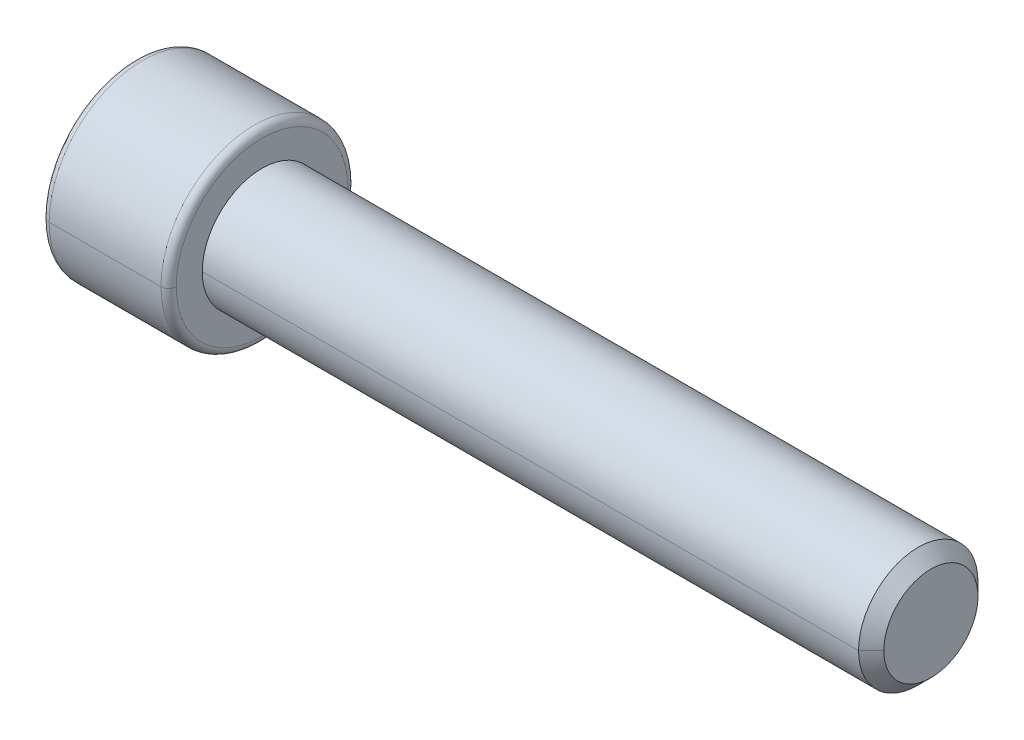
ISO-10303-21;
HEADER;
FILE_DESCRIPTION(('STEP AP214'),'2;1');
FILE_NAME('part.step','',(''),(''),'','','');
FILE_SCHEMA(('AUTOMOTIVE_DESIGN { 1 0 10303 214 1 1 1 1 }'));
ENDSEC;
DATA;
#1=APPLICATION_CONTEXT('core data for automotive mechanical design processes');
#2=APPLICATION_PROTOCOL_DEFINITION('international standard','automotive_design',2000,#1);
#3=PRODUCT_CONTEXT('',#1,'mechanical');
#4=PRODUCT('Part','Part','',(#3));
#5=PRODUCT_RELATED_PRODUCT_CATEGORY('part','',(#4));
#6=PRODUCT_DEFINITION_FORMATION('','',#4);
#7=PRODUCT_DEFINITION_CONTEXT('part definition',#1,'design');
#8=PRODUCT_DEFINITION('design','',#6,#7);
#9=PRODUCT_DEFINITION_SHAPE('','',#8);
#10=(LENGTH_UNIT() NAMED_UNIT(*) SI_UNIT(.MILLI.,.METRE.));
#11=(NAMED_UNIT(*) PLANE_ANGLE_UNIT() SI_UNIT($,.RADIAN.));
#12=(NAMED_UNIT(*) SI_UNIT($,.STERADIAN.) SOLID_ANGLE_UNIT());
#13=UNCERTAINTY_MEASURE_WITH_UNIT(LENGTH_MEASURE(1.E-05),#10,'distance_accuracy_value','');
#14=(GEOMETRIC_REPRESENTATION_CONTEXT(3) GLOBAL_UNCERTAINTY_ASSIGNED_CONTEXT((#13)) GLOBAL_UNIT_ASSIGNED_CONTEXT((#10,
#11,#12)) REPRESENTATION_CONTEXT('',''));
#15=CARTESIAN_POINT('',(0.,0.,0.));
#16=DIRECTION('',(0.,0.,1.));
#17=DIRECTION('',(1.,0.,0.));
#18=AXIS2_PLACEMENT_3D('',#15,#16,#17);
#19=CARTESIAN_POINT('',(-7.9375000000001,0.,0.));
#20=DIRECTION('',(1.,0.,0.));
#21=DIRECTION('',(0.,1.,0.));
#22=AXIS2_PLACEMENT_3D('',#19,#20,#21);
#23=TOROIDAL_SURFACE('',#22,5.699125,0.508);
#24=CARTESIAN_POINT('',(-8.4455,0.,0.));
#25=DIRECTION('',(1.,0.,0.));
#26=DIRECTION('',(0.,0.,-1.));
#27=AXIS2_PLACEMENT_3D('',#24,#25,#26);
#28=CIRCLE('',#27,5.699125);
#29=CARTESIAN_POINT('',(-8.4455000000001,0.,5.699125));
#30=VERTEX_POINT('',#29);
#31=CARTESIAN_POINT('',(-8.4455,0.,-5.699125));
#32=VERTEX_POINT('',#31);
#33=EDGE_CURVE('E11',#30,#32,#28,.T.);
#34=ORIENTED_EDGE('',*,*,#33,.T.);
#35=CARTESIAN_POINT('',(-8.4455000000001,0.,-5.699125));
#36=CARTESIAN_POINT('',(-8.4455001763212,0.,-5.70743713895653));
#37=CARTESIAN_POINT('',(-8.44529599589968,0.,-5.71574926290987));
#38=CARTESIAN_POINT('',(-8.44448018760498,0.,-5.73235349420679));
#39=CARTESIAN_POINT('',(-8.4438685597318,0.,-5.74064560155038));
#40=CARTESIAN_POINT('',(-8.44223912256735,0.,-5.75718981302445));
#41=CARTESIAN_POINT('',(-8.44122131327609,0.,-5.76544191715494));
#42=CARTESIAN_POINT('',(-8.43878202084833,0.,-5.7818862448917));
#43=CARTESIAN_POINT('',(-8.43736053771183,0.,-5.79007846849797));
#44=CARTESIAN_POINT('',(-8.43411730717806,0.,-5.80638329867041));
#45=CARTESIAN_POINT('',(-8.43229555978079,0.,-5.81449590523659));
#46=CARTESIAN_POINT('',(-8.42825619346507,0.,-5.83062195754512));
#47=CARTESIAN_POINT('',(-8.42603857454662,0.,-5.83863540328746));
#48=CARTESIAN_POINT('',(-8.4212128065575,0.,-5.85454382880307));
#49=CARTESIAN_POINT('',(-8.41860465748683,0.,-5.86243880857635));
#50=CARTESIAN_POINT('',(-8.41300411273932,0.,-5.87809128247014));
#51=CARTESIAN_POINT('',(-8.41001171706249,0.,-5.88584877659064));
#52=CARTESIAN_POINT('',(-8.40364988796918,0.,-5.90120759069229));
#53=CARTESIAN_POINT('',(-8.40028045455271,0.,-5.90880891067343));
#54=CARTESIAN_POINT('',(-8.39317266726091,0.,-5.92383706425173));
#55=CARTESIAN_POINT('',(-8.3894343133856,0.,-5.93126389784889));
#56=CARTESIAN_POINT('',(-8.38159769119254,0.,-5.94592518676631));
#57=CARTESIAN_POINT('',(-8.37749942287479,0.,-5.95315964208657));
#58=CARTESIAN_POINT('',(-8.36895284488569,0.,-5.96741874601373));
#59=CARTESIAN_POINT('',(-8.36450453521434,0.,-5.97444339462063));
#60=CARTESIAN_POINT('',(-8.35526859088525,0.,-5.98826596212728));
#61=CARTESIAN_POINT('',(-8.35048095622752,0.,-5.99506388102702));
#62=CARTESIAN_POINT('',(-8.34057789575702,0.,-6.00841661233729));
#63=CARTESIAN_POINT('',(-8.33546246994425,0.,-6.01497142474782));
#64=CARTESIAN_POINT('',(-8.32491615067249,0.,-6.02782215196244));
#65=CARTESIAN_POINT('',(-8.3194852572135,0.,-6.03411806676653));
#66=CARTESIAN_POINT('',(-8.30832108614734,0.,-6.04643583135804));
#67=CARTESIAN_POINT('',(-8.30258780854017,0.,-6.05245768114547));
#68=CARTESIAN_POINT('',(-8.29083268114557,0.,-6.06421280854006));
#69=CARTESIAN_POINT('',(-8.28481083135814,0.,-6.06994608614723));
#70=CARTESIAN_POINT('',(-8.27249306676663,0.,-6.0811102572134));
#71=CARTESIAN_POINT('',(-8.26619715196254,0.,-6.08654115067239));
#72=CARTESIAN_POINT('',(-8.25334642474793,0.,-6.09708746994415));
#73=CARTESIAN_POINT('',(-8.24679161233739,0.,-6.10220289575691));
#74=CARTESIAN_POINT('',(-8.23343888102712,0.,-6.11210595622742));
#75=CARTESIAN_POINT('',(-8.22664096212738,0.,-6.11689359088515));
#76=CARTESIAN_POINT('',(-8.21281839462074,0.,-6.12612953521423));
#77=CARTESIAN_POINT('',(-8.20579374601384,0.,-6.13057784488559));
#78=CARTESIAN_POINT('',(-8.19153464208668,0.,-6.13912442287469));
#79=CARTESIAN_POINT('',(-8.18430018676642,0.,-6.14322269119243));
#80=CARTESIAN_POINT('',(-8.169638897849,0.,-6.15105931338549));
#81=CARTESIAN_POINT('',(-8.16221206425184,0.,-6.15479766726081));
#82=CARTESIAN_POINT('',(-8.14718391067353,0.,-6.1619054545526));
#83=CARTESIAN_POINT('',(-8.13958259069239,0.,-6.16527488796908));
#84=CARTESIAN_POINT('',(-8.12422377659074,0.,-6.17163671706239));
#85=CARTESIAN_POINT('',(-8.11646628247024,0.,-6.17462911273922));
#86=CARTESIAN_POINT('',(-8.10081380857646,0.,-6.18022965748673));
#87=CARTESIAN_POINT('',(-8.09291882880318,0.,-6.1828378065574));
#88=CARTESIAN_POINT('',(-8.07701040328756,0.,-6.18766357454652));
#89=CARTESIAN_POINT('',(-8.06899695754522,0.,-6.18988119346497));
#90=CARTESIAN_POINT('',(-8.0528709052367,0.,-6.19392055978069));
#91=CARTESIAN_POINT('',(-8.04475829867052,0.,-6.19574230717796));
#92=CARTESIAN_POINT('',(-8.02845346849807,0.,-6.19898553771173));
#93=CARTESIAN_POINT('',(-8.02026124489181,0.,-6.20040702084823));
#94=CARTESIAN_POINT('',(-8.00381691715505,0.,-6.20284631327599));
#95=CARTESIAN_POINT('',(-7.99556481302456,0.,-6.20386412256725));
#96=CARTESIAN_POINT('',(-7.97902060155048,0.,-6.2054935597317));
#97=CARTESIAN_POINT('',(-7.97072849420689,0.,-6.20610518760488));
#98=CARTESIAN_POINT('',(-7.95412426290997,0.,-6.20692099589958));
#99=CARTESIAN_POINT('',(-7.94581213895663,0.,-6.2071251763211));
#100=CARTESIAN_POINT('',(-7.9375000000001,0.,-6.207125));
#101=B_SPLINE_CURVE_WITH_KNOTS('',3,(#35,#36,#37,#38,#39,#40,#41,#42,#43,#44,#45,#46,#47,#48,
#49,#50,#51,#52,#53,#54,#55,#56,#57,#58,#59,#60,#61,#62,#63,#64,#65,#66,#67,#68,#69,#70,#71,#72,
#73,#74,#75,#76,#77,#78,#79,#80,#81,#82,#83,#84,#85,#86,#87,#88,#89,#90,#91,#92,#93,#94,#95,#96,
#97,#98,#99,#100),.UNSPECIFIED.,.F.,.F.,(4,2,2,2,2,2,2,2,2,2,2,2,2,2,2,2,2,2,2,2,2,2,2,2,2,2,2,
2,2,2,2,2,4),(0.,0.0249338881792791,0.049867776358558,0.0748016645378365,0.0997355527171156,
0.124669440896394,0.149603329075673,0.174537217254952,0.199471105434231,0.22440499361351,
0.249338881792789,0.274272769972068,0.299206658151346,0.324140546330625,0.349074434509904,
0.374008322689184,0.398942210868461,0.423876099047741,0.44880998722702,0.473743875406298,
0.498677763585578,0.523611651764855,0.548545539944134,0.573479428123415,0.598413316302693,
0.623347204481971,0.648281092661251,0.67321498084053,0.698148869019808,0.723082757199088,
0.748016645378365,0.772950533557645,0.797884421736924),.UNSPECIFIED.);
#102=CARTESIAN_POINT('',(-7.9375,0.,-6.207125));
#103=VERTEX_POINT('',#102);
#104=EDGE_CURVE('E25',#32,#103,#101,.T.);
#105=ORIENTED_EDGE('',*,*,#104,.T.);
#106=CARTESIAN_POINT('',(-7.9375,0.,0.));
#107=DIRECTION('',(1.,0.,0.));
#108=DIRECTION('',(0.,0.,-1.));
#109=AXIS2_PLACEMENT_3D('',#106,#107,#108);
#110=CIRCLE('',#109,6.207125);
#111=CARTESIAN_POINT('',(-7.9375000000001,0.,6.207125));
#112=VERTEX_POINT('',#111);
#113=EDGE_CURVE('E374',#112,#103,#110,.T.);
#114=ORIENTED_EDGE('',*,*,#113,.F.);
#115=CARTESIAN_POINT('',(-8.4455000000001,0.,5.699125));
#116=CARTESIAN_POINT('',(-8.4455001763212,0.,5.70743713895653));
#117=CARTESIAN_POINT('',(-8.44529599589968,0.,5.71574926290987));
#118=CARTESIAN_POINT('',(-8.44448018760498,0.,5.73235349420679));
#119=CARTESIAN_POINT('',(-8.4438685597318,0.,5.74064560155038));
#120=CARTESIAN_POINT('',(-8.44223912256735,0.,5.75718981302445));
#121=CARTESIAN_POINT('',(-8.44122131327609,0.,5.76544191715494));
#122=CARTESIAN_POINT('',(-8.43878202084833,0.,5.7818862448917));
#123=CARTESIAN_POINT('',(-8.43736053771183,0.,5.79007846849797));
#124=CARTESIAN_POINT('',(-8.43411730717806,0.,5.80638329867041));
#125=CARTESIAN_POINT('',(-8.43229555978079,0.,5.8144959052366));
#126=CARTESIAN_POINT('',(-8.42825619346507,0.,5.83062195754512));
#127=CARTESIAN_POINT('',(-8.42603857454662,0.,5.83863540328746));
#128=CARTESIAN_POINT('',(-8.4212128065575,0.,5.85454382880307));
#129=CARTESIAN_POINT('',(-8.41860465748683,0.,5.86243880857635));
#130=CARTESIAN_POINT('',(-8.41300411273932,0.,5.87809128247014));
#131=CARTESIAN_POINT('',(-8.41001171706249,0.,5.88584877659064));
#132=CARTESIAN_POINT('',(-8.40364988796918,0.,5.90120759069229));
#133=CARTESIAN_POINT('',(-8.40028045455271,0.,5.90880891067343));
#134=CARTESIAN_POINT('',(-8.39317266726091,0.,5.92383706425173));
#135=CARTESIAN_POINT('',(-8.3894343133856,0.,5.9312638978489));
#136=CARTESIAN_POINT('',(-8.38159769119254,0.,5.94592518676632));
#137=CARTESIAN_POINT('',(-8.37749942287479,0.,5.95315964208658));
#138=CARTESIAN_POINT('',(-8.36895284488569,0.,5.96741874601373));
#139=CARTESIAN_POINT('',(-8.36450453521434,0.,5.97444339462063));
#140=CARTESIAN_POINT('',(-8.35526859088525,0.,5.98826596212728));
#141=CARTESIAN_POINT('',(-8.35048095622752,0.,5.99506388102702));
#142=CARTESIAN_POINT('',(-8.34057789575702,0.,6.00841661233729));
#143=CARTESIAN_POINT('',(-8.33546246994425,0.,6.01497142474782));
#144=CARTESIAN_POINT('',(-8.32491615067249,0.,6.02782215196244));
#145=CARTESIAN_POINT('',(-8.3194852572135,0.,6.03411806676653));
#146=CARTESIAN_POINT('',(-8.30832108614734,0.,6.04643583135804));
#147=CARTESIAN_POINT('',(-8.30258780854017,0.,6.05245768114547));
#148=CARTESIAN_POINT('',(-8.29083268114557,0.,6.06421280854006));
#149=CARTESIAN_POINT('',(-8.28481083135814,0.,6.06994608614724));
#150=CARTESIAN_POINT('',(-8.27249306676663,0.,6.0811102572134));
#151=CARTESIAN_POINT('',(-8.26619715196254,0.,6.08654115067239));
#152=CARTESIAN_POINT('',(-8.25334642474793,0.,6.09708746994415));
#153=CARTESIAN_POINT('',(-8.24679161233739,0.,6.10220289575692));
#154=CARTESIAN_POINT('',(-8.23343888102712,0.,6.11210595622742));
#155=CARTESIAN_POINT('',(-8.22664096212738,0.,6.11689359088515));
#156=CARTESIAN_POINT('',(-8.21281839462074,0.,6.12612953521423));
#157=CARTESIAN_POINT('',(-8.20579374601384,0.,6.13057784488559));
#158=CARTESIAN_POINT('',(-8.19153464208668,0.,6.13912442287469));
#159=CARTESIAN_POINT('',(-8.18430018676642,0.,6.14322269119243));
#160=CARTESIAN_POINT('',(-8.169638897849,0.,6.15105931338549));
#161=CARTESIAN_POINT('',(-8.16221206425184,0.,6.15479766726081));
#162=CARTESIAN_POINT('',(-8.14718391067353,0.,6.1619054545526));
#163=CARTESIAN_POINT('',(-8.13958259069239,0.,6.16527488796908));
#164=CARTESIAN_POINT('',(-8.12422377659074,0.,6.17163671706239));
#165=CARTESIAN_POINT('',(-8.11646628247024,0.,6.17462911273922));
#166=CARTESIAN_POINT('',(-8.10081380857646,0.,6.18022965748673));
#167=CARTESIAN_POINT('',(-8.09291882880318,0.,6.1828378065574));
#168=CARTESIAN_POINT('',(-8.07701040328756,0.,6.18766357454652));
#169=CARTESIAN_POINT('',(-8.06899695754522,0.,6.18988119346497));
#170=CARTESIAN_POINT('',(-8.0528709052367,0.,6.19392055978069));
#171=CARTESIAN_POINT('',(-8.04475829867052,0.,6.19574230717796));
#172=CARTESIAN_POINT('',(-8.02845346849807,0.,6.19898553771173));
#173=CARTESIAN_POINT('',(-8.02026124489181,0.,6.20040702084823));
#174=CARTESIAN_POINT('',(-8.00381691715505,0.,6.20284631327599));
#175=CARTESIAN_POINT('',(-7.99556481302456,0.,6.20386412256725));
#176=CARTESIAN_POINT('',(-7.97902060155048,0.,6.2054935597317));
#177=CARTESIAN_POINT('',(-7.97072849420689,0.,6.20610518760488));
#178=CARTESIAN_POINT('',(-7.95412426290997,0.,6.20692099589958));
#179=CARTESIAN_POINT('',(-7.94581213895663,0.,6.2071251763211));
#180=CARTESIAN_POINT('',(-7.9375000000001,0.,6.207125));
#181=B_SPLINE_CURVE_WITH_KNOTS('',3,(#115,#116,#117,#118,#119,#120,#121,#122,#123,#124,#125,
#126,#127,#128,#129,#130,#131,#132,#133,#134,#135,#136,#137,#138,#139,#140,#141,#142,#143,#144,
#145,#146,#147,#148,#149,#150,#151,#152,#153,#154,#155,#156,#157,#158,#159,#160,#161,#162,#163,
#164,#165,#166,#167,#168,#169,#170,#171,#172,#173,#174,#175,#176,#177,#178,#179,#180),
.UNSPECIFIED.,.F.,.F.,(4,2,2,2,2,2,2,2,2,2,2,2,2,2,2,2,2,2,2,2,2,2,2,2,2,2,2,2,2,2,2,2,4),(0.,
0.0249338881792782,0.0498677763585571,0.0748016645378365,0.0997355527171148,0.124669440896394,
0.149603329075673,0.174537217254952,0.19947110543423,0.224404993613509,0.249338881792789,
0.274272769972068,0.299206658151346,0.324140546330624,0.349074434509904,0.374008322689183,
0.398942210868461,0.42387609904774,0.448809987227019,0.473743875406298,0.498677763585577,
0.523611651764856,0.548545539944135,0.573479428123414,0.598413316302692,0.623347204481971,
0.64828109266125,0.673214980840529,0.698148869019807,0.723082757199087,0.748016645378365,
0.772950533557644,0.797884421736924),.UNSPECIFIED.);
#182=EDGE_CURVE('E362',#30,#112,#181,.T.);
#183=ORIENTED_EDGE('',*,*,#182,.F.);
#184=EDGE_LOOP('',(#34,#105,#114,#183));
#185=FACE_BOUND('',#184,.T.);
#186=ADVANCED_FACE('F16',(#185),#23,.T.);
#187=CARTESIAN_POINT('',(-7.9375000000001,0.,0.));
#188=DIRECTION('',(1.,0.,0.));
#189=DIRECTION('',(0.,-1.,0.));
#190=AXIS2_PLACEMENT_3D('',#187,#188,#189);
#191=TOROIDAL_SURFACE('',#190,5.699125,0.508);
#192=CARTESIAN_POINT('',(-7.9375,0.,0.));
#193=DIRECTION('',(1.,0.,0.));
#194=DIRECTION('',(0.,0.,-1.));
#195=AXIS2_PLACEMENT_3D('',#192,#193,#194);
#196=CIRCLE('',#195,6.207125);
#197=EDGE_CURVE('E359',#103,#112,#196,.T.);
#198=ORIENTED_EDGE('',*,*,#197,.F.);
#199=ORIENTED_EDGE('',*,*,#104,.F.);
#200=CARTESIAN_POINT('',(-8.4455,0.,0.));
#201=DIRECTION('',(1.,0.,0.));
#202=DIRECTION('',(0.,0.,-1.));
#203=AXIS2_PLACEMENT_3D('',#200,#201,#202);
#204=CIRCLE('',#203,5.699125);
#205=EDGE_CURVE('E324',#32,#30,#204,.T.);
#206=ORIENTED_EDGE('',*,*,#205,.T.);
#207=ORIENTED_EDGE('',*,*,#182,.T.);
#208=EDGE_LOOP('',(#198,#199,#206,#207));
#209=FACE_BOUND('',#208,.T.);
#210=ADVANCED_FACE('F332',(#209),#191,.T.);
#211=CARTESIAN_POINT('',(-8.4455,0.,0.));
#212=DIRECTION('',(1.,0.,0.));
#213=DIRECTION('',(0.,0.,-1.));
#214=AXIS2_PLACEMENT_3D('',#211,#212,#213);
#215=PLANE('',#214);
#216=ORIENTED_EDGE('',*,*,#205,.F.);
#217=ORIENTED_EDGE('',*,*,#33,.F.);
#218=EDGE_LOOP('',(#216,#217));
#219=FACE_BOUND('',#218,.T.);
#220=DIRECTION('',(0.,-1.,0.));
#221=VECTOR('',#220,1.);
#222=CARTESIAN_POINT('',(-8.4455,1.8330871046771,3.175));
#223=LINE('',#222,#221);
#224=CARTESIAN_POINT('',(-8.4455,1.8330871046771,3.175));
#225=VERTEX_POINT('',#224);
#226=CARTESIAN_POINT('',(-8.4455,-1.8330871046771,3.175));
#227=VERTEX_POINT('',#226);
#228=EDGE_CURVE('E320',#225,#227,#223,.T.);
#229=ORIENTED_EDGE('',*,*,#228,.T.);
#230=DIRECTION('',(0.,-0.499999999999987,-0.866025403784446));
#231=VECTOR('',#230,1.);
#232=CARTESIAN_POINT('',(-8.4455,-1.8330871046771,3.175));
#233=LINE('',#232,#231);
#234=CARTESIAN_POINT('',(-8.4455,-3.66617420935411,0.));
#235=VERTEX_POINT('',#234);
#236=EDGE_CURVE('E316',#227,#235,#233,.T.);
#237=ORIENTED_EDGE('',*,*,#236,.T.);
#238=DIRECTION('',(0.,0.499999999999987,-0.866025403784446));
#239=VECTOR('',#238,1.);
#240=CARTESIAN_POINT('',(-8.4455,-3.66617420935411,0.));
#241=LINE('',#240,#239);
#242=CARTESIAN_POINT('',(-8.4455,-1.8330871046771,-3.175));
#243=VERTEX_POINT('',#242);
#244=EDGE_CURVE('E312',#235,#243,#241,.T.);
#245=ORIENTED_EDGE('',*,*,#244,.T.);
#246=DIRECTION('',(0.,1.,0.));
#247=VECTOR('',#246,1.);
#248=CARTESIAN_POINT('',(-8.4455,-1.8330871046771,-3.175));
#249=LINE('',#248,#247);
#250=CARTESIAN_POINT('',(-8.4455,1.8330871046771,-3.175));
#251=VERTEX_POINT('',#250);
#252=EDGE_CURVE('E308',#243,#251,#249,.T.);
#253=ORIENTED_EDGE('',*,*,#252,.T.);
#254=DIRECTION('',(0.,0.499999999999987,0.866025403784446));
#255=VECTOR('',#254,1.);
#256=CARTESIAN_POINT('',(-8.4455,1.8330871046771,-3.175));
#257=LINE('',#256,#255);
#258=CARTESIAN_POINT('',(-8.4455,3.66617420935411,0.));
#259=VERTEX_POINT('',#258);
#260=EDGE_CURVE('E304',#251,#259,#257,.T.);
#261=ORIENTED_EDGE('',*,*,#260,.T.);
#262=DIRECTION('',(0.,-0.499999999999987,0.866025403784446));
#263=VECTOR('',#262,1.);
#264=CARTESIAN_POINT('',(-8.4455,3.66617420935411,0.));
#265=LINE('',#264,#263);
#266=EDGE_CURVE('E300',#259,#225,#265,.T.);
#267=ORIENTED_EDGE('',*,*,#266,.T.);
#268=EDGE_LOOP('',(#229,#237,#245,#253,#261,#267));
#269=FACE_BOUND('',#268,.T.);
#270=ADVANCED_FACE('F341',(#219,#269),#215,.F.);
#271=CARTESIAN_POINT('',(-5.2705,3.66617420935411,0.));
#272=DIRECTION('',(0.,-0.866025403784446,-0.499999999999987));
#273=DIRECTION('',(0.,0.499999999999987,-0.866025403784446));
#274=AXIS2_PLACEMENT_3D('',#271,#272,#273);
#275=PLANE('',#274);
#276=ORIENTED_EDGE('',*,*,#266,.F.);
#277=DIRECTION('',(-1.,0.,0.));
#278=VECTOR('',#277,1.);
#279=CARTESIAN_POINT('',(-5.2705,3.66617420935411,0.));
#280=LINE('',#279,#278);
#281=CARTESIAN_POINT('',(-5.2705,3.66617420935411,0.));
#282=VERTEX_POINT('',#281);
#283=EDGE_CURVE('E295',#282,#259,#280,.T.);
#284=ORIENTED_EDGE('',*,*,#283,.F.);
#285=DIRECTION('',(0.,-0.499999999999987,0.866025403784446));
#286=VECTOR('',#285,1.);
#287=CARTESIAN_POINT('',(-5.2705,3.66617420935411,0.));
#288=LINE('',#287,#286);
#289=CARTESIAN_POINT('',(-5.2705,1.8330871046771,3.175));
#290=VERTEX_POINT('',#289);
#291=EDGE_CURVE('E291',#282,#290,#288,.T.);
#292=ORIENTED_EDGE('',*,*,#291,.T.);
#293=DIRECTION('',(-1.,0.,0.));
#294=VECTOR('',#293,1.);
#295=CARTESIAN_POINT('',(-5.2705,1.8330871046771,3.175));
#296=LINE('',#295,#294);
#297=EDGE_CURVE('E286',#290,#225,#296,.T.);
#298=ORIENTED_EDGE('',*,*,#297,.T.);
#299=EDGE_LOOP('',(#276,#284,#292,#298));
#300=FACE_BOUND('',#299,.T.);
#301=ADVANCED_FACE('F412',(#300),#275,.T.);
#302=CARTESIAN_POINT('',(-5.2705,1.8330871046771,3.175));
#303=DIRECTION('',(0.,0.,-1.));
#304=DIRECTION('',(-1.,0.,0.));
#305=AXIS2_PLACEMENT_3D('',#302,#303,#304);
#306=PLANE('',#305);
#307=ORIENTED_EDGE('',*,*,#228,.F.);
#308=ORIENTED_EDGE('',*,*,#297,.F.);
#309=DIRECTION('',(0.,-1.,0.));
#310=VECTOR('',#309,1.);
#311=CARTESIAN_POINT('',(-5.2705,1.8330871046771,3.175));
#312=LINE('',#311,#310);
#313=CARTESIAN_POINT('',(-5.2705,-1.8330871046771,3.175));
#314=VERTEX_POINT('',#313);
#315=EDGE_CURVE('E282',#290,#314,#312,.T.);
#316=ORIENTED_EDGE('',*,*,#315,.T.);
#317=DIRECTION('',(-1.,0.,0.));
#318=VECTOR('',#317,1.);
#319=CARTESIAN_POINT('',(-5.2705,-1.8330871046771,3.175));
#320=LINE('',#319,#318);
#321=EDGE_CURVE('E277',#314,#227,#320,.T.);
#322=ORIENTED_EDGE('',*,*,#321,.T.);
#323=EDGE_LOOP('',(#307,#308,#316,#322));
#324=FACE_BOUND('',#323,.T.);
#325=ADVANCED_FACE('F419',(#324),#306,.T.);
#326=CARTESIAN_POINT('',(-5.2705,-1.8330871046771,3.175));
#327=DIRECTION('',(0.,0.866025403784446,-0.499999999999987));
#328=DIRECTION('',(0.,0.499999999999987,0.866025403784446));
#329=AXIS2_PLACEMENT_3D('',#326,#327,#328);
#330=PLANE('',#329);
#331=ORIENTED_EDGE('',*,*,#236,.F.);
#332=ORIENTED_EDGE('',*,*,#321,.F.);
#333=DIRECTION('',(0.,-0.499999999999987,-0.866025403784446));
#334=VECTOR('',#333,1.);
#335=CARTESIAN_POINT('',(-5.2705,-1.8330871046771,3.175));
#336=LINE('',#335,#334);
#337=CARTESIAN_POINT('',(-5.2705,-3.66617420935411,0.));
#338=VERTEX_POINT('',#337);
#339=EDGE_CURVE('E273',#314,#338,#336,.T.);
#340=ORIENTED_EDGE('',*,*,#339,.T.);
#341=DIRECTION('',(-1.,0.,0.));
#342=VECTOR('',#341,1.);
#343=CARTESIAN_POINT('',(-5.2705,-3.66617420935411,0.));
#344=LINE('',#343,#342);
#345=EDGE_CURVE('E268',#338,#235,#344,.T.);
#346=ORIENTED_EDGE('',*,*,#345,.T.);
#347=EDGE_LOOP('',(#331,#332,#340,#346));
#348=FACE_BOUND('',#347,.T.);
#349=ADVANCED_FACE('F426',(#348),#330,.T.);
#350=CARTESIAN_POINT('',(-5.2705,-3.66617420935411,0.));
#351=DIRECTION('',(0.,0.866025403784446,0.499999999999987));
#352=DIRECTION('',(0.,-0.499999999999987,0.866025403784446));
#353=AXIS2_PLACEMENT_3D('',#350,#351,#352);
#354=PLANE('',#353);
#355=ORIENTED_EDGE('',*,*,#244,.F.);
#356=ORIENTED_EDGE('',*,*,#345,.F.);
#357=DIRECTION('',(0.,0.499999999999987,-0.866025403784446));
#358=VECTOR('',#357,1.);
#359=CARTESIAN_POINT('',(-5.2705,-3.66617420935411,0.));
#360=LINE('',#359,#358);
#361=CARTESIAN_POINT('',(-5.2705,-1.8330871046771,-3.175));
#362=VERTEX_POINT('',#361);
#363=EDGE_CURVE('E264',#338,#362,#360,.T.);
#364=ORIENTED_EDGE('',*,*,#363,.T.);
#365=DIRECTION('',(-1.,0.,0.));
#366=VECTOR('',#365,1.);
#367=CARTESIAN_POINT('',(-5.2705,-1.8330871046771,-3.175));
#368=LINE('',#367,#366);
#369=EDGE_CURVE('E259',#362,#243,#368,.T.);
#370=ORIENTED_EDGE('',*,*,#369,.T.);
#371=EDGE_LOOP('',(#355,#356,#364,#370));
#372=FACE_BOUND('',#371,.T.);
#373=ADVANCED_FACE('F434',(#372),#354,.T.);
#374=CARTESIAN_POINT('',(-5.2705,-1.8330871046771,-3.175));
#375=DIRECTION('',(0.,0.,1.));
#376=DIRECTION('',(1.,0.,0.));
#377=AXIS2_PLACEMENT_3D('',#374,#375,#376);
#378=PLANE('',#377);
#379=ORIENTED_EDGE('',*,*,#252,.F.);
#380=ORIENTED_EDGE('',*,*,#369,.F.);
#381=DIRECTION('',(0.,1.,0.));
#382=VECTOR('',#381,1.);
#383=CARTESIAN_POINT('',(-5.2705,-1.8330871046771,-3.175));
#384=LINE('',#383,#382);
#385=CARTESIAN_POINT('',(-5.2705,1.8330871046771,-3.175));
#386=VERTEX_POINT('',#385);
#387=EDGE_CURVE('E255',#362,#386,#384,.T.);
#388=ORIENTED_EDGE('',*,*,#387,.T.);
#389=DIRECTION('',(-1.,0.,0.));
#390=VECTOR('',#389,1.);
#391=CARTESIAN_POINT('',(-5.2705,1.8330871046771,-3.175));
#392=LINE('',#391,#390);
#393=EDGE_CURVE('E250',#386,#251,#392,.T.);
#394=ORIENTED_EDGE('',*,*,#393,.T.);
#395=EDGE_LOOP('',(#379,#380,#388,#394));
#396=FACE_BOUND('',#395,.T.);
#397=ADVANCED_FACE('F442',(#396),#378,.T.);
#398=CARTESIAN_POINT('',(-5.2705,1.8330871046771,-3.175));
#399=DIRECTION('',(0.,-0.866025403784446,0.499999999999987));
#400=DIRECTION('',(0.,-0.499999999999987,-0.866025403784446));
#401=AXIS2_PLACEMENT_3D('',#398,#399,#400);
#402=PLANE('',#401);
#403=ORIENTED_EDGE('',*,*,#260,.F.);
#404=ORIENTED_EDGE('',*,*,#393,.F.);
#405=DIRECTION('',(0.,0.499999999999987,0.866025403784446));
#406=VECTOR('',#405,1.);
#407=CARTESIAN_POINT('',(-5.2705,1.8330871046771,-3.175));
#408=LINE('',#407,#406);
#409=EDGE_CURVE('E245',#386,#282,#408,.T.);
#410=ORIENTED_EDGE('',*,*,#409,.T.);
#411=ORIENTED_EDGE('',*,*,#283,.T.);
#412=EDGE_LOOP('',(#403,#404,#410,#411));
#413=FACE_BOUND('',#412,.T.);
#414=ADVANCED_FACE('F450',(#413),#402,.T.);
#415=CARTESIAN_POINT('',(-5.2705,0.,0.));
#416=DIRECTION('',(1.,0.,0.));
#417=DIRECTION('',(0.,0.,-1.));
#418=AXIS2_PLACEMENT_3D('',#415,#416,#417);
#419=PLANE('',#418);
#420=ORIENTED_EDGE('',*,*,#315,.F.);
#421=ORIENTED_EDGE('',*,*,#291,.F.);
#422=ORIENTED_EDGE('',*,*,#409,.F.);
#423=ORIENTED_EDGE('',*,*,#387,.F.);
#424=ORIENTED_EDGE('',*,*,#363,.F.);
#425=ORIENTED_EDGE('',*,*,#339,.F.);
#426=EDGE_LOOP('',(#420,#421,#422,#423,#424,#425));
#427=FACE_BOUND('',#426,.T.);
#428=ADVANCED_FACE('F458',(#427),#419,.F.);
#429=CARTESIAN_POINT('',(44.45,0.,0.));
#430=DIRECTION('',(-1.,0.,0.));
#431=DIRECTION('',(0.,-1.,0.));
#432=AXIS2_PLACEMENT_3D('',#429,#430,#431);
#433=CYLINDRICAL_SURFACE('',#432,6.207125);
#434=CARTESIAN_POINT('',(-0.508000000000003,0.,0.));
#435=DIRECTION('',(1.,0.,0.));
#436=DIRECTION('',(0.,0.,-1.));
#437=AXIS2_PLACEMENT_3D('',#434,#435,#436);
#438=CIRCLE('',#437,6.207125);
#439=CARTESIAN_POINT('',(-0.508000000000003,0.,-6.207125));
#440=VERTEX_POINT('',#439);
#441=CARTESIAN_POINT('',(-0.508000000000003,0.,6.207125));
#442=VERTEX_POINT('',#441);
#443=EDGE_CURVE('E241',#440,#442,#438,.T.);
#444=ORIENTED_EDGE('',*,*,#443,.F.);
#445=DIRECTION('',(-1.,0.,0.));
#446=VECTOR('',#445,1.);
#447=CARTESIAN_POINT('',(-0.508000000000003,0.,-6.207125));
#448=LINE('',#447,#446);
#449=EDGE_CURVE('E236',#440,#103,#448,.T.);
#450=ORIENTED_EDGE('',*,*,#449,.T.);
#451=ORIENTED_EDGE('',*,*,#197,.T.);
#452=DIRECTION('',(-1.,0.,0.));
#453=VECTOR('',#452,1.);
#454=CARTESIAN_POINT('',(-0.508000000000003,0.,6.207125));
#455=LINE('',#454,#453);
#456=EDGE_CURVE('E231',#442,#112,#455,.T.);
#457=ORIENTED_EDGE('',*,*,#456,.F.);
#458=EDGE_LOOP('',(#444,#450,#451,#457));
#459=FACE_BOUND('',#458,.T.);
#460=ADVANCED_FACE('F389',(#459),#433,.T.);
#461=CARTESIAN_POINT('',(44.45,0.,0.));
#462=DIRECTION('',(-1.,0.,0.));
#463=DIRECTION('',(0.,1.,0.));
#464=AXIS2_PLACEMENT_3D('',#461,#462,#463);
#465=CYLINDRICAL_SURFACE('',#464,6.207125);
#466=ORIENTED_EDGE('',*,*,#113,.T.);
#467=ORIENTED_EDGE('',*,*,#449,.F.);
#468=CARTESIAN_POINT('',(-0.508000000000003,0.,0.));
#469=DIRECTION('',(1.,0.,0.));
#470=DIRECTION('',(0.,0.,-1.));
#471=AXIS2_PLACEMENT_3D('',#468,#469,#470);
#472=CIRCLE('',#471,6.207125);
#473=EDGE_CURVE('E229',#442,#440,#472,.T.);
#474=ORIENTED_EDGE('',*,*,#473,.F.);
#475=ORIENTED_EDGE('',*,*,#456,.T.);
#476=EDGE_LOOP('',(#466,#467,#474,#475));
#477=FACE_BOUND('',#476,.T.);
#478=ADVANCED_FACE('F391',(#477),#465,.T.);
#479=CARTESIAN_POINT('',(-0.507999999999936,0.,0.));
#480=DIRECTION('',(1.,0.,0.));
#481=DIRECTION('',(0.,1.,0.));
#482=AXIS2_PLACEMENT_3D('',#479,#480,#481);
#483=TOROIDAL_SURFACE('',#482,5.699125,0.508);
#484=ORIENTED_EDGE('',*,*,#473,.T.);
#485=CARTESIAN_POINT('',(-0.507999999999936,0.,-6.207125));
#486=CARTESIAN_POINT('',(-0.499687861043404,0.,-6.2071251763211));
#487=CARTESIAN_POINT('',(-0.491375737090069,0.,-6.20692099589958));
#488=CARTESIAN_POINT('',(-0.474771505793147,0.,-6.20610518760488));
#489=CARTESIAN_POINT('',(-0.466479398449558,0.,-6.2054935597317));
#490=CARTESIAN_POINT('',(-0.449935186975481,0.,-6.20386412256725));
#491=CARTESIAN_POINT('',(-0.441683082844991,0.,-6.20284631327599));
#492=CARTESIAN_POINT('',(-0.425238755108234,0.,-6.20040702084823));
#493=CARTESIAN_POINT('',(-0.417046531501967,0.,-6.19898553771172));
#494=CARTESIAN_POINT('',(-0.400741701329519,0.,-6.19574230717796));
#495=CARTESIAN_POINT('',(-0.392629094763338,0.,-6.19392055978069));
#496=CARTESIAN_POINT('',(-0.376503042454818,0.,-6.18988119346497));
#497=CARTESIAN_POINT('',(-0.368489596712479,0.,-6.18766357454652));
#498=CARTESIAN_POINT('',(-0.35258117119686,0.,-6.1828378065574));
#499=CARTESIAN_POINT('',(-0.34468619142358,0.,-6.18022965748673));
#500=CARTESIAN_POINT('',(-0.329033717529797,0.,-6.17462911273922));
#501=CARTESIAN_POINT('',(-0.321276223409294,0.,-6.17163671706239));
#502=CARTESIAN_POINT('',(-0.305917409307648,0.,-6.16527488796908));
#503=CARTESIAN_POINT('',(-0.298316089326505,0.,-6.1619054545526));
#504=CARTESIAN_POINT('',(-0.283287935748201,0.,-6.15479766726081));
#505=CARTESIAN_POINT('',(-0.27586110215104,0.,-6.1510593133855));
#506=CARTESIAN_POINT('',(-0.261199813233619,0.,-6.14322269119243));
#507=CARTESIAN_POINT('',(-0.25396535791336,0.,-6.13912442287469));
#508=CARTESIAN_POINT('',(-0.2397062539862,0.,-6.13057784488559));
#509=CARTESIAN_POINT('',(-0.2326816053793,0.,-6.12612953521424));
#510=CARTESIAN_POINT('',(-0.218859037872658,0.,-6.11689359088515));
#511=CARTESIAN_POINT('',(-0.212061118972917,0.,-6.11210595622742));
#512=CARTESIAN_POINT('',(-0.198708387662645,0.,-6.10220289575692));
#513=CARTESIAN_POINT('',(-0.192153575252114,0.,-6.09708746994415));
#514=CARTESIAN_POINT('',(-0.179302848037496,0.,-6.08654115067239));
#515=CARTESIAN_POINT('',(-0.173006933233408,0.,-6.0811102572134));
#516=CARTESIAN_POINT('',(-0.160689168641895,0.,-6.06994608614724));
#517=CARTESIAN_POINT('',(-0.15466731885447,0.,-6.06421280854006));
#518=CARTESIAN_POINT('',(-0.142912191459872,0.,-6.05245768114547));
#519=CARTESIAN_POINT('',(-0.137178913852699,0.,-6.04643583135804));
#520=CARTESIAN_POINT('',(-0.126014742786536,0.,-6.03411806676653));
#521=CARTESIAN_POINT('',(-0.120583849327545,0.,-6.02782215196244));
#522=CARTESIAN_POINT('',(-0.110037530055787,0.,-6.01497142474782));
#523=CARTESIAN_POINT('',(-0.104922104243019,0.,-6.00841661233729));
#524=CARTESIAN_POINT('',(-0.0950190437725189,0.,-5.99506388102702));
#525=CARTESIAN_POINT('',(-0.0902314091147865,0.,-5.98826596212728));
#526=CARTESIAN_POINT('',(-0.0809954647857009,0.,-5.97444339462064));
#527=CARTESIAN_POINT('',(-0.0765471551143478,0.,-5.96741874601374));
#528=CARTESIAN_POINT('',(-0.0680005771252492,0.,-5.95315964208658));
#529=CARTESIAN_POINT('',(-0.0639023088075037,0.,-5.94592518676632));
#530=CARTESIAN_POINT('',(-0.0560656866144408,0.,-5.9312638978489));
#531=CARTESIAN_POINT('',(-0.0523273327391234,0.,-5.92383706425174));
#532=CARTESIAN_POINT('',(-0.0452195454473315,0.,-5.90880891067343));
#533=CARTESIAN_POINT('',(-0.041850112030857,0.,-5.90120759069229));
#534=CARTESIAN_POINT('',(-0.035488282937549,0.,-5.88584877659064));
#535=CARTESIAN_POINT('',(-0.0324958872607155,0.,-5.87809128247014));
#536=CARTESIAN_POINT('',(-0.0268953425132085,0.,-5.86243880857636));
#537=CARTESIAN_POINT('',(-0.0242871934425349,0.,-5.85454382880308));
#538=CARTESIAN_POINT('',(-0.019461425453414,0.,-5.83863540328746));
#539=CARTESIAN_POINT('',(-0.0172438065349666,0.,-5.83062195754512));
#540=CARTESIAN_POINT('',(-0.0132044402192498,0.,-5.8144959052366));
#541=CARTESIAN_POINT('',(-0.0113826928219804,0.,-5.80638329867042));
#542=CARTESIAN_POINT('',(-0.00813946228821041,0.,-5.79007846849797));
#543=CARTESIAN_POINT('',(-0.00671797915170981,0.,-5.7818862448917));
#544=CARTESIAN_POINT('',(-0.0042786867239457,0.,-5.76544191715494));
#545=CARTESIAN_POINT('',(-0.00326087743268219,0.,-5.75718981302446));
#546=CARTESIAN_POINT('',(-0.00163144026823876,0.,-5.74064560155038));
#547=CARTESIAN_POINT('',(-0.00101981239505883,0.,-5.73235349420679));
#548=CARTESIAN_POINT('',(-0.000204004100358731,0.,-5.71574926290987));
#549=CARTESIAN_POINT('',(1.76321161439174E-07,0.,-5.70743713895653));
#550=CARTESIAN_POINT('',(0.,0.,-5.699125));
#551=B_SPLINE_CURVE_WITH_KNOTS('',3,(#485,#486,#487,#488,#489,#490,#491,#492,#493,#494,#495,
#496,#497,#498,#499,#500,#501,#502,#503,#504,#505,#506,#507,#508,#509,#510,#511,#512,#513,#514,
#515,#516,#517,#518,#519,#520,#521,#522,#523,#524,#525,#526,#527,#528,#529,#530,#531,#532,#533,
#534,#535,#536,#537,#538,#539,#540,#541,#542,#543,#544,#545,#546,#547,#548,#549,#550),
.UNSPECIFIED.,.F.,.F.,(4,2,2,2,2,2,2,2,2,2,2,2,2,2,2,2,2,2,2,2,2,2,2,2,2,2,2,2,2,2,2,2,4),(0.,
0.0249338881792789,0.0498677763585577,0.0748016645378366,0.0997355527171155,0.124669440896394,
0.149603329075673,0.174537217254952,0.199471105434231,0.22440499361351,0.249338881792788,
0.274272769972067,0.299206658151346,0.324140546330625,0.349074434509904,0.374008322689183,
0.398942210868462,0.42387609904774,0.44880998722702,0.473743875406298,0.498677763585577,
0.523611651764856,0.548545539944135,0.573479428123414,0.598413316302693,0.623347204481971,
0.64828109266125,0.673214980840529,0.698148869019808,0.723082757199087,0.748016645378366,
0.772950533557644,0.797884421736924),.UNSPECIFIED.);
#552=CARTESIAN_POINT('',(0.,0.,-5.699125));
#553=VERTEX_POINT('',#552);
#554=EDGE_CURVE('E197',#440,#553,#551,.T.);
#555=ORIENTED_EDGE('',*,*,#554,.T.);
#556=CARTESIAN_POINT('',(0.,0.,0.));
#557=DIRECTION('',(1.,0.,0.));
#558=DIRECTION('',(0.,0.,-1.));
#559=AXIS2_PLACEMENT_3D('',#556,#557,#558);
#560=CIRCLE('',#559,5.699125);
#561=CARTESIAN_POINT('',(0.,0.,5.699125));
#562=VERTEX_POINT('',#561);
#563=EDGE_CURVE('E215',#562,#553,#560,.T.);
#564=ORIENTED_EDGE('',*,*,#563,.F.);
#565=CARTESIAN_POINT('',(-0.507999999999936,0.,6.207125));
#566=CARTESIAN_POINT('',(-0.499687861043404,0.,6.2071251763211));
#567=CARTESIAN_POINT('',(-0.491375737090069,0.,6.20692099589958));
#568=CARTESIAN_POINT('',(-0.474771505793146,0.,6.20610518760488));
#569=CARTESIAN_POINT('',(-0.466479398449558,0.,6.2054935597317));
#570=CARTESIAN_POINT('',(-0.44993518697548,0.,6.20386412256725));
#571=CARTESIAN_POINT('',(-0.441683082844991,0.,6.20284631327599));
#572=CARTESIAN_POINT('',(-0.425238755108234,0.,6.20040702084823));
#573=CARTESIAN_POINT('',(-0.417046531501967,0.,6.19898553771172));
#574=CARTESIAN_POINT('',(-0.400741701329519,0.,6.19574230717796));
#575=CARTESIAN_POINT('',(-0.392629094763338,0.,6.19392055978069));
#576=CARTESIAN_POINT('',(-0.376503042454818,0.,6.18988119346497));
#577=CARTESIAN_POINT('',(-0.368489596712479,0.,6.18766357454652));
#578=CARTESIAN_POINT('',(-0.35258117119686,0.,6.1828378065574));
#579=CARTESIAN_POINT('',(-0.34468619142358,0.,6.18022965748673));
#580=CARTESIAN_POINT('',(-0.329033717529797,0.,6.17462911273922));
#581=CARTESIAN_POINT('',(-0.321276223409294,0.,6.17163671706239));
#582=CARTESIAN_POINT('',(-0.305917409307648,0.,6.16527488796908));
#583=CARTESIAN_POINT('',(-0.298316089326505,0.,6.1619054545526));
#584=CARTESIAN_POINT('',(-0.283287935748201,0.,6.15479766726081));
#585=CARTESIAN_POINT('',(-0.27586110215104,0.,6.1510593133855));
#586=CARTESIAN_POINT('',(-0.261199813233619,0.,6.14322269119243));
#587=CARTESIAN_POINT('',(-0.25396535791336,0.,6.13912442287469));
#588=CARTESIAN_POINT('',(-0.2397062539862,0.,6.13057784488559));
#589=CARTESIAN_POINT('',(-0.232681605379299,0.,6.12612953521424));
#590=CARTESIAN_POINT('',(-0.218859037872658,0.,6.11689359088515));
#591=CARTESIAN_POINT('',(-0.212061118972916,0.,6.11210595622742));
#592=CARTESIAN_POINT('',(-0.198708387662644,0.,6.10220289575692));
#593=CARTESIAN_POINT('',(-0.192153575252114,0.,6.09708746994415));
#594=CARTESIAN_POINT('',(-0.179302848037495,0.,6.08654115067239));
#595=CARTESIAN_POINT('',(-0.173006933233408,0.,6.0811102572134));
#596=CARTESIAN_POINT('',(-0.160689168641895,0.,6.06994608614724));
#597=CARTESIAN_POINT('',(-0.154667318854469,0.,6.06421280854006));
#598=CARTESIAN_POINT('',(-0.142912191459871,0.,6.05245768114547));
#599=CARTESIAN_POINT('',(-0.137178913852699,0.,6.04643583135804));
#600=CARTESIAN_POINT('',(-0.126014742786536,0.,6.03411806676653));
#601=CARTESIAN_POINT('',(-0.120583849327545,0.,6.02782215196244));
#602=CARTESIAN_POINT('',(-0.110037530055787,0.,6.01497142474782));
#603=CARTESIAN_POINT('',(-0.104922104243019,0.,6.00841661233729));
#604=CARTESIAN_POINT('',(-0.0950190437725187,0.,5.99506388102702));
#605=CARTESIAN_POINT('',(-0.0902314091147864,0.,5.98826596212728));
#606=CARTESIAN_POINT('',(-0.0809954647857009,0.,5.97444339462064));
#607=CARTESIAN_POINT('',(-0.0765471551143477,0.,5.96741874601374));
#608=CARTESIAN_POINT('',(-0.0680005771252491,0.,5.95315964208658));
#609=CARTESIAN_POINT('',(-0.0639023088075036,0.,5.94592518676632));
#610=CARTESIAN_POINT('',(-0.0560656866144408,0.,5.9312638978489));
#611=CARTESIAN_POINT('',(-0.0523273327391234,0.,5.92383706425174));
#612=CARTESIAN_POINT('',(-0.0452195454473315,0.,5.90880891067343));
#613=CARTESIAN_POINT('',(-0.0418501120308569,0.,5.90120759069229));
#614=CARTESIAN_POINT('',(-0.0354882829375489,0.,5.88584877659064));
#615=CARTESIAN_POINT('',(-0.0324958872607155,0.,5.87809128247014));
#616=CARTESIAN_POINT('',(-0.0268953425132085,0.,5.86243880857636));
#617=CARTESIAN_POINT('',(-0.0242871934425349,0.,5.85454382880308));
#618=CARTESIAN_POINT('',(-0.0194614254534139,0.,5.83863540328746));
#619=CARTESIAN_POINT('',(-0.0172438065349665,0.,5.83062195754512));
#620=CARTESIAN_POINT('',(-0.0132044402192498,0.,5.8144959052366));
#621=CARTESIAN_POINT('',(-0.0113826928219804,0.,5.80638329867042));
#622=CARTESIAN_POINT('',(-0.00813946228821043,0.,5.79007846849797));
#623=CARTESIAN_POINT('',(-0.00671797915170981,0.,5.7818862448917));
#624=CARTESIAN_POINT('',(-0.0042786867239457,0.,5.76544191715494));
#625=CARTESIAN_POINT('',(-0.00326087743268219,0.,5.75718981302446));
#626=CARTESIAN_POINT('',(-0.00163144026823876,0.,5.74064560155038));
#627=CARTESIAN_POINT('',(-0.00101981239505883,0.,5.73235349420679));
#628=CARTESIAN_POINT('',(-0.00020400410035873,0.,5.71574926290987));
#629=CARTESIAN_POINT('',(1.76321161440391E-07,0.,5.70743713895653));
#630=CARTESIAN_POINT('',(0.,0.,5.699125));
#631=B_SPLINE_CURVE_WITH_KNOTS('',3,(#565,#566,#567,#568,#569,#570,#571,#572,#573,#574,#575,
#576,#577,#578,#579,#580,#581,#582,#583,#584,#585,#586,#587,#588,#589,#590,#591,#592,#593,#594,
#595,#596,#597,#598,#599,#600,#601,#602,#603,#604,#605,#606,#607,#608,#609,#610,#611,#612,#613,
#614,#615,#616,#617,#618,#619,#620,#621,#622,#623,#624,#625,#626,#627,#628,#629,#630),
.UNSPECIFIED.,.F.,.F.,(4,2,2,2,2,2,2,2,2,2,2,2,2,2,2,2,2,2,2,2,2,2,2,2,2,2,2,2,2,2,2,2,4),(0.,
0.0249338881792789,0.0498677763585577,0.0748016645378366,0.0997355527171154,0.124669440896394,
0.149603329075673,0.174537217254952,0.199471105434231,0.22440499361351,0.249338881792789,
0.274272769972067,0.299206658151346,0.324140546330625,0.349074434509904,0.374008322689183,
0.398942210868461,0.42387609904774,0.448809987227019,0.473743875406298,0.498677763585577,
0.523611651764855,0.548545539944134,0.573479428123413,0.598413316302692,0.623347204481971,
0.64828109266125,0.673214980840529,0.698148869019808,0.723082757199087,0.748016645378365,
0.772950533557644,0.797884421736923),.UNSPECIFIED.);
#632=EDGE_CURVE('E200',#442,#562,#631,.T.);
#633=ORIENTED_EDGE('',*,*,#632,.F.);
#634=EDGE_LOOP('',(#484,#555,#564,#633));
#635=FACE_BOUND('',#634,.T.);
#636=ADVANCED_FACE('F179',(#635),#483,.T.);
#637=CARTESIAN_POINT('',(-0.507999999999936,0.,0.));
#638=DIRECTION('',(1.,0.,0.));
#639=DIRECTION('',(0.,-1.,0.));
#640=AXIS2_PLACEMENT_3D('',#637,#638,#639);
#641=TOROIDAL_SURFACE('',#640,5.699125,0.508);
#642=CARTESIAN_POINT('',(0.,0.,0.));
#643=DIRECTION('',(1.,0.,0.));
#644=DIRECTION('',(0.,0.,-1.));
#645=AXIS2_PLACEMENT_3D('',#642,#643,#644);
#646=CIRCLE('',#645,5.699125);
#647=EDGE_CURVE('E159',#553,#562,#646,.T.);
#648=ORIENTED_EDGE('',*,*,#647,.F.);
#649=ORIENTED_EDGE('',*,*,#554,.F.);
#650=ORIENTED_EDGE('',*,*,#443,.T.);
#651=ORIENTED_EDGE('',*,*,#632,.T.);
#652=EDGE_LOOP('',(#648,#649,#650,#651));
#653=FACE_BOUND('',#652,.T.);
#654=ADVANCED_FACE('F168',(#653),#641,.T.);
#655=CARTESIAN_POINT('',(0.,5.699125,0.));
#656=DIRECTION('',(-1.,0.,0.));
#657=DIRECTION('',(0.,0.,1.));
#658=AXIS2_PLACEMENT_3D('',#655,#656,#657);
#659=PLANE('',#658);
#660=CARTESIAN_POINT('',(0.,0.,0.));
#661=DIRECTION('',(1.,0.,0.));
#662=DIRECTION('',(0.,0.,-1.));
#663=AXIS2_PLACEMENT_3D('',#660,#661,#662);
#664=CIRCLE('',#663,3.96875);
#665=CARTESIAN_POINT('',(0.,0.,-3.96875));
#666=VERTEX_POINT('',#665);
#667=CARTESIAN_POINT('',(0.,0.,3.96875));
#668=VERTEX_POINT('',#667);
#669=EDGE_CURVE('E154',#666,#668,#664,.T.);
#670=ORIENTED_EDGE('',*,*,#669,.F.);
#671=CARTESIAN_POINT('',(0.,0.,0.));
#672=DIRECTION('',(1.,0.,0.));
#673=DIRECTION('',(0.,0.,-1.));
#674=AXIS2_PLACEMENT_3D('',#671,#672,#673);
#675=CIRCLE('',#674,3.96875);
#676=EDGE_CURVE('E149',#668,#666,#675,.T.);
#677=ORIENTED_EDGE('',*,*,#676,.F.);
#678=EDGE_LOOP('',(#670,#677));
#679=FACE_BOUND('',#678,.T.);
#680=ORIENTED_EDGE('',*,*,#647,.T.);
#681=ORIENTED_EDGE('',*,*,#563,.T.);
#682=EDGE_LOOP('',(#680,#681));
#683=FACE_BOUND('',#682,.T.);
#684=ADVANCED_FACE('F178',(#679,#683),#659,.F.);
#685=CARTESIAN_POINT('',(44.45,0.,0.));
#686=DIRECTION('',(-1.,0.,0.));
#687=DIRECTION('',(0.,1.,0.));
#688=AXIS2_PLACEMENT_3D('',#685,#686,#687);
#689=CYLINDRICAL_SURFACE('',#688,3.96875);
#690=ORIENTED_EDGE('',*,*,#676,.T.);
#691=DIRECTION('',(-1.,0.,0.));
#692=VECTOR('',#691,1.);
#693=CARTESIAN_POINT('',(43.61053,0.,-3.96875));
#694=LINE('',#693,#692);
#695=CARTESIAN_POINT('',(43.61053,0.,-3.96875));
#696=VERTEX_POINT('',#695);
#697=EDGE_CURVE('E144',#696,#666,#694,.T.);
#698=ORIENTED_EDGE('',*,*,#697,.F.);
#699=CARTESIAN_POINT('',(43.61053,0.,0.));
#700=DIRECTION('',(1.,0.,0.));
#701=DIRECTION('',(0.,0.,-1.));
#702=AXIS2_PLACEMENT_3D('',#699,#700,#701);
#703=CIRCLE('',#702,3.96875);
#704=CARTESIAN_POINT('',(43.61053,0.,3.96875));
#705=VERTEX_POINT('',#704);
#706=EDGE_CURVE('E140',#705,#696,#703,.T.);
#707=ORIENTED_EDGE('',*,*,#706,.F.);
#708=DIRECTION('',(-1.,0.,0.));
#709=VECTOR('',#708,1.);
#710=CARTESIAN_POINT('',(43.61053,0.,3.96875));
#711=LINE('',#710,#709);
#712=EDGE_CURVE('E128',#705,#668,#711,.T.);
#713=ORIENTED_EDGE('',*,*,#712,.T.);
#714=EDGE_LOOP('',(#690,#698,#707,#713));
#715=FACE_BOUND('',#714,.T.);
#716=ADVANCED_FACE('F499',(#715),#689,.T.);
#717=CARTESIAN_POINT('',(44.45,0.,0.));
#718=DIRECTION('',(-1.,0.,0.));
#719=DIRECTION('',(0.,-1.,0.));
#720=AXIS2_PLACEMENT_3D('',#717,#718,#719);
#721=CYLINDRICAL_SURFACE('',#720,3.96875);
#722=CARTESIAN_POINT('',(43.61053,0.,0.));
#723=DIRECTION('',(1.,0.,0.));
#724=DIRECTION('',(0.,0.,-1.));
#725=AXIS2_PLACEMENT_3D('',#722,#723,#724);
#726=CIRCLE('',#725,3.96875);
#727=EDGE_CURVE('E116',#696,#705,#726,.T.);
#728=ORIENTED_EDGE('',*,*,#727,.F.);
#729=ORIENTED_EDGE('',*,*,#697,.T.);
#730=ORIENTED_EDGE('',*,*,#669,.T.);
#731=ORIENTED_EDGE('',*,*,#712,.F.);
#732=EDGE_LOOP('',(#728,#729,#730,#731));
#733=FACE_BOUND('',#732,.T.);
#734=ADVANCED_FACE('F508',(#733),#721,.T.);
#735=CARTESIAN_POINT('',(43.61053,0.,0.));
#736=DIRECTION('',(-1.,0.,0.));
#737=DIRECTION('',(0.,-1.,0.));
#738=AXIS2_PLACEMENT_3D('',#735,#736,#737);
#739=CONICAL_SURFACE('',#738,3.96875,0.7853981634);
#740=CARTESIAN_POINT('',(44.45,0.,0.));
#741=DIRECTION('',(1.,0.,0.));
#742=DIRECTION('',(0.,0.,-1.));
#743=AXIS2_PLACEMENT_3D('',#740,#741,#742);
#744=CIRCLE('',#743,3.12928);
#745=CARTESIAN_POINT('',(44.45,0.,-3.12928));
#746=VERTEX_POINT('',#745);
#747=CARTESIAN_POINT('',(44.4499999999979,0.,3.12927999999786));
#748=VERTEX_POINT('',#747);
#749=EDGE_CURVE('E113',#746,#748,#744,.T.);
#750=ORIENTED_EDGE('',*,*,#749,.F.);
#751=DIRECTION('',(-0.707106781184745,0.,-0.707106781188351));
#752=VECTOR('',#751,1.);
#753=CARTESIAN_POINT('',(44.4499999999979,0.,-3.12927999999786));
#754=LINE('',#753,#752);
#755=EDGE_CURVE('E119',#746,#696,#754,.T.);
#756=ORIENTED_EDGE('',*,*,#755,.T.);
#757=ORIENTED_EDGE('',*,*,#727,.T.);
#758=DIRECTION('',(-0.707106781184744,0.,0.707106781188351));
#759=VECTOR('',#758,1.);
#760=CARTESIAN_POINT('',(44.4499999999979,0.,3.12927999999786));
#761=LINE('',#760,#759);
#762=EDGE_CURVE('E108',#748,#705,#761,.T.);
#763=ORIENTED_EDGE('',*,*,#762,.F.);
#764=EDGE_LOOP('',(#750,#756,#757,#763));
#765=FACE_BOUND('',#764,.T.);
#766=ADVANCED_FACE('F110',(#765),#739,.T.);
#767=CARTESIAN_POINT('',(43.61053,0.,0.));
#768=DIRECTION('',(-1.,0.,0.));
#769=DIRECTION('',(0.,1.,0.));
#770=AXIS2_PLACEMENT_3D('',#767,#768,#769);
#771=CONICAL_SURFACE('',#770,3.96875,0.7853981634);
#772=ORIENTED_EDGE('',*,*,#706,.T.);
#773=ORIENTED_EDGE('',*,*,#755,.F.);
#774=CARTESIAN_POINT('',(44.45,0.,0.));
#775=DIRECTION('',(1.,0.,0.));
#776=DIRECTION('',(0.,0.,-1.));
#777=AXIS2_PLACEMENT_3D('',#774,#775,#776);
#778=CIRCLE('',#777,3.12928);
#779=EDGE_CURVE('E120',#748,#746,#778,.T.);
#780=ORIENTED_EDGE('',*,*,#779,.F.);
#781=ORIENTED_EDGE('',*,*,#762,.T.);
#782=EDGE_LOOP('',(#772,#773,#780,#781));
#783=FACE_BOUND('',#782,.T.);
#784=ADVANCED_FACE('F123',(#783),#771,.T.);
#785=CARTESIAN_POINT('',(44.45,3.12928,0.));
#786=DIRECTION('',(-1.,0.,0.));
#787=DIRECTION('',(0.,0.,1.));
#788=AXIS2_PLACEMENT_3D('',#785,#786,#787);
#789=PLANE('',#788);
#790=ORIENTED_EDGE('',*,*,#749,.T.);
#791=ORIENTED_EDGE('',*,*,#779,.T.);
#792=EDGE_LOOP('',(#790,#791));
#793=FACE_BOUND('',#792,.T.);
#794=ADVANCED_FACE('F126',(#793),#789,.F.);
#795=CLOSED_SHELL('',(#186,#210,#270,#301,#325,#349,#373,#397,#414,#428,#460,#478,#636,#654,
#684,#716,#734,#766,#784,#794));
#796=MANIFOLD_SOLID_BREP('B1',#795);
#797=ADVANCED_BREP_SHAPE_REPRESENTATION('',(#18,#796),#14);
#798=SHAPE_DEFINITION_REPRESENTATION(#9,#797);
ENDSEC;
END-ISO-10303-21;
